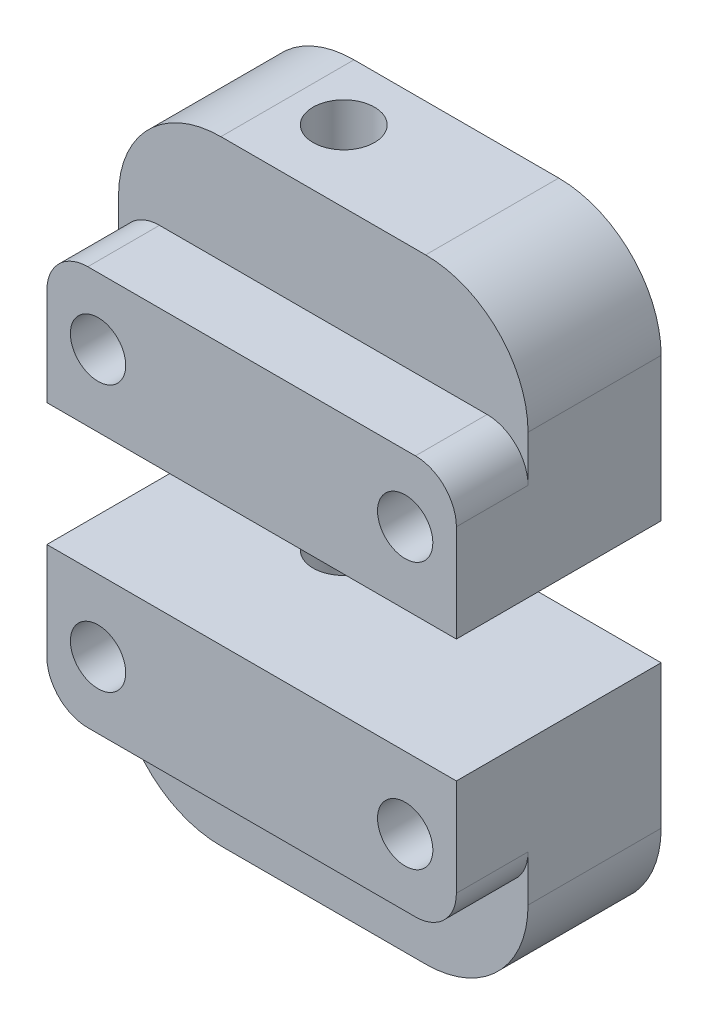
ISO-10303-21;
HEADER;
FILE_DESCRIPTION(('STEP AP214'),'2;1');
FILE_NAME('part.step','',(''),(''),'','','');
FILE_SCHEMA(('AUTOMOTIVE_DESIGN { 1 0 10303 214 1 1 1 1 }'));
ENDSEC;
DATA;
#1=APPLICATION_CONTEXT('core data for automotive mechanical design processes');
#2=APPLICATION_PROTOCOL_DEFINITION('international standard','automotive_design',2000,#1);
#3=PRODUCT_CONTEXT('',#1,'mechanical');
#4=PRODUCT('Part','Part','',(#3));
#5=PRODUCT_RELATED_PRODUCT_CATEGORY('part','',(#4));
#6=PRODUCT_DEFINITION_FORMATION('','',#4);
#7=PRODUCT_DEFINITION_CONTEXT('part definition',#1,'design');
#8=PRODUCT_DEFINITION('design','',#6,#7);
#9=PRODUCT_DEFINITION_SHAPE('','',#8);
#10=(LENGTH_UNIT() NAMED_UNIT(*) SI_UNIT(.MILLI.,.METRE.));
#11=(NAMED_UNIT(*) PLANE_ANGLE_UNIT() SI_UNIT($,.RADIAN.));
#12=(NAMED_UNIT(*) SI_UNIT($,.STERADIAN.) SOLID_ANGLE_UNIT());
#13=UNCERTAINTY_MEASURE_WITH_UNIT(LENGTH_MEASURE(1.E-05),#10,'distance_accuracy_value','');
#14=(GEOMETRIC_REPRESENTATION_CONTEXT(3) GLOBAL_UNCERTAINTY_ASSIGNED_CONTEXT((#13)) GLOBAL_UNIT_ASSIGNED_CONTEXT((#10,
#11,#12)) REPRESENTATION_CONTEXT('',''));
#15=CARTESIAN_POINT('',(0.,0.,0.));
#16=DIRECTION('',(0.,0.,1.));
#17=DIRECTION('',(1.,0.,0.));
#18=AXIS2_PLACEMENT_3D('',#15,#16,#17);
#19=CARTESIAN_POINT('',(-10.,15.,0.));
#20=DIRECTION('',(-1.,0.,0.));
#21=DIRECTION('',(0.,0.,1.));
#22=AXIS2_PLACEMENT_3D('',#19,#20,#21);
#23=PLANE('',#22);
#24=DIRECTION('',(0.,0.,1.));
#25=VECTOR('',#24,1.);
#26=CARTESIAN_POINT('',(-10.,-3.,0.));
#27=LINE('',#26,#25);
#28=CARTESIAN_POINT('',(-10.,-3.,-10.));
#29=VERTEX_POINT('',#28);
#30=CARTESIAN_POINT('',(-10.,-3.,0.));
#31=VERTEX_POINT('',#30);
#32=EDGE_CURVE('E55',#29,#31,#27,.T.);
#33=ORIENTED_EDGE('',*,*,#32,.F.);
#34=DIRECTION('',(0.,-1.,0.));
#35=VECTOR('',#34,1.);
#36=CARTESIAN_POINT('',(-10.,15.,-10.));
#37=LINE('',#36,#35);
#38=CARTESIAN_POINT('',(-10.,-10.,-10.));
#39=VERTEX_POINT('',#38);
#40=EDGE_CURVE('E49',#29,#39,#37,.T.);
#41=ORIENTED_EDGE('',*,*,#40,.T.);
#42=DIRECTION('',(0.,0.,-1.));
#43=VECTOR('',#42,1.);
#44=CARTESIAN_POINT('',(-10.,-10.,-3.5));
#45=LINE('',#44,#43);
#46=CARTESIAN_POINT('',(-10.,-10.,-3.5));
#47=VERTEX_POINT('',#46);
#48=EDGE_CURVE('E162',#39,#47,#45,.F.);
#49=ORIENTED_EDGE('',*,*,#48,.T.);
#50=DIRECTION('',(0.,-1.,0.));
#51=VECTOR('',#50,1.);
#52=CARTESIAN_POINT('',(-10.,0.,-3.5));
#53=LINE('',#52,#51);
#54=CARTESIAN_POINT('',(-10.,-7.75,-3.5));
#55=VERTEX_POINT('',#54);
#56=EDGE_CURVE('E174',#55,#47,#53,.T.);
#57=ORIENTED_EDGE('',*,*,#56,.F.);
#58=DIRECTION('',(0.,0.,-1.));
#59=VECTOR('',#58,1.);
#60=CARTESIAN_POINT('',(-10.,-7.75,0.));
#61=LINE('',#60,#59);
#62=CARTESIAN_POINT('',(-10.,-7.75,0.));
#63=VERTEX_POINT('',#62);
#64=EDGE_CURVE('E158',#55,#63,#61,.F.);
#65=ORIENTED_EDGE('',*,*,#64,.T.);
#66=DIRECTION('',(0.,-1.,0.));
#67=VECTOR('',#66,1.);
#68=CARTESIAN_POINT('',(-10.,15.,0.));
#69=LINE('',#68,#67);
#70=EDGE_CURVE('E155',#31,#63,#69,.T.);
#71=ORIENTED_EDGE('',*,*,#70,.F.);
#72=EDGE_LOOP('',(#33,#41,#49,#57,#65,#71));
#73=FACE_BOUND('',#72,.T.);
#74=ADVANCED_FACE('F46',(#73),#23,.T.);
#75=CARTESIAN_POINT('',(0.,15.,0.));
#76=DIRECTION('',(0.,0.,-1.));
#77=DIRECTION('',(-1.,0.,0.));
#78=AXIS2_PLACEMENT_3D('',#75,#76,#77);
#79=PLANE('',#78);
#80=CARTESIAN_POINT('',(7.5,-6.5,0.));
#81=DIRECTION('',(0.,0.,-1.));
#82=DIRECTION('',(-1.,0.,0.));
#83=AXIS2_PLACEMENT_3D('',#80,#81,#82);
#84=CIRCLE('',#83,1.35);
#85=CARTESIAN_POINT('',(6.15,-6.5,0.));
#86=VERTEX_POINT('',#85);
#87=EDGE_CURVE('E161',#86,#86,#84,.T.);
#88=ORIENTED_EDGE('',*,*,#87,.T.);
#89=EDGE_LOOP('',(#88));
#90=FACE_BOUND('',#89,.T.);
#91=CARTESIAN_POINT('',(-7.5,-6.5,0.));
#92=DIRECTION('',(0.,0.,-1.));
#93=DIRECTION('',(1.,0.,0.));
#94=AXIS2_PLACEMENT_3D('',#91,#92,#93);
#95=CIRCLE('',#94,1.35);
#96=CARTESIAN_POINT('',(-6.15,-6.5,0.));
#97=VERTEX_POINT('',#96);
#98=EDGE_CURVE('E200',#97,#97,#95,.T.);
#99=ORIENTED_EDGE('',*,*,#98,.T.);
#100=EDGE_LOOP('',(#99));
#101=FACE_BOUND('',#100,.T.);
#102=DIRECTION('',(0.,-1.,0.));
#103=VECTOR('',#102,1.);
#104=CARTESIAN_POINT('',(10.,15.,0.));
#105=LINE('',#104,#103);
#106=CARTESIAN_POINT('',(10.,-3.,0.));
#107=VERTEX_POINT('',#106);
#108=CARTESIAN_POINT('',(10.,-7.75,0.));
#109=VERTEX_POINT('',#108);
#110=EDGE_CURVE('E145',#107,#109,#105,.T.);
#111=ORIENTED_EDGE('',*,*,#110,.F.);
#112=DIRECTION('',(-1.,0.,0.));
#113=VECTOR('',#112,1.);
#114=CARTESIAN_POINT('',(10.,-3.,0.));
#115=LINE('',#114,#113);
#116=EDGE_CURVE('E203',#107,#31,#115,.T.);
#117=ORIENTED_EDGE('',*,*,#116,.T.);
#118=ORIENTED_EDGE('',*,*,#70,.T.);
#119=CARTESIAN_POINT('',(-8.,-7.75,0.));
#120=DIRECTION('',(0.,0.,-1.));
#121=DIRECTION('',(-1.,0.,0.));
#122=AXIS2_PLACEMENT_3D('',#119,#120,#121);
#123=CIRCLE('',#122,2.);
#124=CARTESIAN_POINT('',(-8.,-9.75,0.));
#125=VERTEX_POINT('',#124);
#126=EDGE_CURVE('E152',#63,#125,#123,.F.);
#127=ORIENTED_EDGE('',*,*,#126,.T.);
#128=DIRECTION('',(1.,0.,0.));
#129=VECTOR('',#128,1.);
#130=CARTESIAN_POINT('',(-10.,-9.75,0.));
#131=LINE('',#130,#129);
#132=CARTESIAN_POINT('',(8.,-9.75,0.));
#133=VERTEX_POINT('',#132);
#134=EDGE_CURVE('E154',#125,#133,#131,.T.);
#135=ORIENTED_EDGE('',*,*,#134,.T.);
#136=CARTESIAN_POINT('',(8.,-7.75,0.));
#137=DIRECTION('',(0.,0.,-1.));
#138=DIRECTION('',(-1.,0.,0.));
#139=AXIS2_PLACEMENT_3D('',#136,#137,#138);
#140=CIRCLE('',#139,2.);
#141=EDGE_CURVE('E156',#133,#109,#140,.F.);
#142=ORIENTED_EDGE('',*,*,#141,.T.);
#143=EDGE_LOOP('',(#111,#117,#118,#127,#135,#142));
#144=FACE_BOUND('',#143,.T.);
#145=ADVANCED_FACE('F246',(#90,#101,#144),#79,.F.);
#146=CARTESIAN_POINT('',(10.,15.,0.));
#147=DIRECTION('',(-1.,0.,0.));
#148=DIRECTION('',(0.,0.,1.));
#149=AXIS2_PLACEMENT_3D('',#146,#147,#148);
#150=PLANE('',#149);
#151=DIRECTION('',(0.,-1.,0.));
#152=VECTOR('',#151,1.);
#153=CARTESIAN_POINT('',(10.,15.,-10.));
#154=LINE('',#153,#152);
#155=CARTESIAN_POINT('',(10.,-3.,-10.));
#156=VERTEX_POINT('',#155);
#157=CARTESIAN_POINT('',(10.,-10.,-10.));
#158=VERTEX_POINT('',#157);
#159=EDGE_CURVE('E170',#156,#158,#154,.T.);
#160=ORIENTED_EDGE('',*,*,#159,.F.);
#161=DIRECTION('',(0.,0.,1.));
#162=VECTOR('',#161,1.);
#163=CARTESIAN_POINT('',(10.,-3.,0.));
#164=LINE('',#163,#162);
#165=EDGE_CURVE('E148',#156,#107,#164,.T.);
#166=ORIENTED_EDGE('',*,*,#165,.T.);
#167=ORIENTED_EDGE('',*,*,#110,.T.);
#168=DIRECTION('',(0.,0.,-1.));
#169=VECTOR('',#168,1.);
#170=CARTESIAN_POINT('',(10.,-7.75,-3.5));
#171=LINE('',#170,#169);
#172=CARTESIAN_POINT('',(10.,-7.75,-3.5));
#173=VERTEX_POINT('',#172);
#174=EDGE_CURVE('E131',#109,#173,#171,.T.);
#175=ORIENTED_EDGE('',*,*,#174,.T.);
#176=DIRECTION('',(0.,-1.,0.));
#177=VECTOR('',#176,1.);
#178=CARTESIAN_POINT('',(10.,0.,-3.5));
#179=LINE('',#178,#177);
#180=CARTESIAN_POINT('',(10.,-10.,-3.5));
#181=VERTEX_POINT('',#180);
#182=EDGE_CURVE('E116',#173,#181,#179,.T.);
#183=ORIENTED_EDGE('',*,*,#182,.T.);
#184=DIRECTION('',(0.,0.,-1.));
#185=VECTOR('',#184,1.);
#186=CARTESIAN_POINT('',(10.,-10.,0.));
#187=LINE('',#186,#185);
#188=EDGE_CURVE('E130',#181,#158,#187,.T.);
#189=ORIENTED_EDGE('',*,*,#188,.T.);
#190=EDGE_LOOP('',(#160,#166,#167,#175,#183,#189));
#191=FACE_BOUND('',#190,.T.);
#192=ADVANCED_FACE('F142',(#191),#150,.F.);
#193=CARTESIAN_POINT('',(-2.5,15.,-7.));
#194=DIRECTION('',(0.,-1.,0.));
#195=DIRECTION('',(0.,0.,-1.));
#196=AXIS2_PLACEMENT_3D('',#193,#194,#195);
#197=CYLINDRICAL_SURFACE('',#196,1.5);
#198=CARTESIAN_POINT('',(-2.5,-3.,-7.));
#199=DIRECTION('',(0.,-1.,0.));
#200=DIRECTION('',(0.,0.,-1.));
#201=AXIS2_PLACEMENT_3D('',#198,#199,#200);
#202=CIRCLE('',#201,1.5);
#203=CARTESIAN_POINT('',(-2.5,-3.,-8.5));
#204=VERTEX_POINT('',#203);
#205=EDGE_CURVE('E215',#204,#204,#202,.T.);
#206=ORIENTED_EDGE('',*,*,#205,.F.);
#207=EDGE_LOOP('',(#206));
#208=FACE_BOUND('',#207,.T.);
#209=CARTESIAN_POINT('',(-2.5,-15.,-7.));
#210=DIRECTION('',(0.,1.,0.));
#211=DIRECTION('',(0.,0.,1.));
#212=AXIS2_PLACEMENT_3D('',#209,#210,#211);
#213=CIRCLE('',#212,1.5);
#214=CARTESIAN_POINT('',(-2.5,-15.,-5.5));
#215=VERTEX_POINT('',#214);
#216=EDGE_CURVE('E180',#215,#215,#213,.T.);
#217=ORIENTED_EDGE('',*,*,#216,.F.);
#218=EDGE_LOOP('',(#217));
#219=FACE_BOUND('',#218,.T.);
#220=ADVANCED_FACE('F272',(#208,#219),#197,.F.);
#221=CARTESIAN_POINT('',(0.,15.,-10.));
#222=DIRECTION('',(0.,0.,1.));
#223=DIRECTION('',(1.,0.,0.));
#224=AXIS2_PLACEMENT_3D('',#221,#222,#223);
#225=PLANE('',#224);
#226=CARTESIAN_POINT('',(7.5,-6.5,-10.));
#227=DIRECTION('',(0.,0.,-1.));
#228=DIRECTION('',(1.,0.,0.));
#229=AXIS2_PLACEMENT_3D('',#226,#227,#228);
#230=CIRCLE('',#229,2.25);
#231=CARTESIAN_POINT('',(9.75,-6.5,-10.));
#232=VERTEX_POINT('',#231);
#233=EDGE_CURVE('E212',#232,#232,#230,.T.);
#234=ORIENTED_EDGE('',*,*,#233,.F.);
#235=EDGE_LOOP('',(#234));
#236=FACE_BOUND('',#235,.T.);
#237=CARTESIAN_POINT('',(-7.5,-6.5,-10.));
#238=DIRECTION('',(0.,0.,-1.));
#239=DIRECTION('',(-1.,0.,0.));
#240=AXIS2_PLACEMENT_3D('',#237,#238,#239);
#241=CIRCLE('',#240,2.25);
#242=CARTESIAN_POINT('',(-9.75,-6.5,-10.));
#243=VERTEX_POINT('',#242);
#244=EDGE_CURVE('E204',#243,#243,#241,.T.);
#245=ORIENTED_EDGE('',*,*,#244,.F.);
#246=EDGE_LOOP('',(#245));
#247=FACE_BOUND('',#246,.T.);
#248=ORIENTED_EDGE('',*,*,#40,.F.);
#249=DIRECTION('',(-1.,0.,0.));
#250=VECTOR('',#249,1.);
#251=CARTESIAN_POINT('',(10.,-3.,-10.));
#252=LINE('',#251,#250);
#253=EDGE_CURVE('E12',#156,#29,#252,.T.);
#254=ORIENTED_EDGE('',*,*,#253,.F.);
#255=ORIENTED_EDGE('',*,*,#159,.T.);
#256=CARTESIAN_POINT('',(5.,-10.,-10.));
#257=DIRECTION('',(0.,0.,1.));
#258=DIRECTION('',(1.,0.,0.));
#259=AXIS2_PLACEMENT_3D('',#256,#257,#258);
#260=CIRCLE('',#259,5.);
#261=CARTESIAN_POINT('',(5.,-15.,-10.));
#262=VERTEX_POINT('',#261);
#263=EDGE_CURVE('E186',#158,#262,#260,.F.);
#264=ORIENTED_EDGE('',*,*,#263,.T.);
#265=DIRECTION('',(-1.,0.,0.));
#266=VECTOR('',#265,1.);
#267=CARTESIAN_POINT('',(0.,-15.,-10.));
#268=LINE('',#267,#266);
#269=CARTESIAN_POINT('',(-5.,-15.,-10.));
#270=VERTEX_POINT('',#269);
#271=EDGE_CURVE('E185',#262,#270,#268,.T.);
#272=ORIENTED_EDGE('',*,*,#271,.T.);
#273=CARTESIAN_POINT('',(-5.,-10.,-10.));
#274=DIRECTION('',(0.,0.,1.));
#275=DIRECTION('',(1.,0.,0.));
#276=AXIS2_PLACEMENT_3D('',#273,#274,#275);
#277=CIRCLE('',#276,5.);
#278=EDGE_CURVE('E182',#270,#39,#277,.F.);
#279=ORIENTED_EDGE('',*,*,#278,.T.);
#280=EDGE_LOOP('',(#248,#254,#255,#264,#272,#279));
#281=FACE_BOUND('',#280,.T.);
#282=ADVANCED_FACE('F227',(#236,#247,#281),#225,.F.);
#283=CARTESIAN_POINT('',(-7.5,-6.5,0.));
#284=DIRECTION('',(0.,0.,-1.));
#285=DIRECTION('',(-1.,0.,0.));
#286=AXIS2_PLACEMENT_3D('',#283,#284,#285);
#287=CYLINDRICAL_SURFACE('',#286,1.35);
#288=ORIENTED_EDGE('',*,*,#98,.F.);
#289=EDGE_LOOP('',(#288));
#290=FACE_BOUND('',#289,.T.);
#291=CARTESIAN_POINT('',(-7.5,-6.5,-7.));
#292=DIRECTION('',(0.,0.,-1.));
#293=DIRECTION('',(-1.,0.,0.));
#294=AXIS2_PLACEMENT_3D('',#291,#292,#293);
#295=CIRCLE('',#294,1.35);
#296=CARTESIAN_POINT('',(-8.85,-6.5,-7.));
#297=VERTEX_POINT('',#296);
#298=EDGE_CURVE('E208',#297,#297,#295,.F.);
#299=ORIENTED_EDGE('',*,*,#298,.F.);
#300=EDGE_LOOP('',(#299));
#301=FACE_BOUND('',#300,.T.);
#302=ADVANCED_FACE('F278',(#290,#301),#287,.F.);
#303=CARTESIAN_POINT('',(0.,-15.,0.));
#304=DIRECTION('',(0.,1.,0.));
#305=DIRECTION('',(0.,0.,1.));
#306=AXIS2_PLACEMENT_3D('',#303,#304,#305);
#307=PLANE('',#306);
#308=ORIENTED_EDGE('',*,*,#216,.T.);
#309=EDGE_LOOP('',(#308));
#310=FACE_BOUND('',#309,.T.);
#311=DIRECTION('',(1.,0.,0.));
#312=VECTOR('',#311,1.);
#313=CARTESIAN_POINT('',(-10.,-15.,-3.5));
#314=LINE('',#313,#312);
#315=CARTESIAN_POINT('',(-5.,-15.,-3.5));
#316=VERTEX_POINT('',#315);
#317=CARTESIAN_POINT('',(5.,-15.,-3.5));
#318=VERTEX_POINT('',#317);
#319=EDGE_CURVE('E173',#316,#318,#314,.T.);
#320=ORIENTED_EDGE('',*,*,#319,.F.);
#321=DIRECTION('',(0.,0.,-1.));
#322=VECTOR('',#321,1.);
#323=CARTESIAN_POINT('',(-5.,-15.,-10.));
#324=LINE('',#323,#322);
#325=EDGE_CURVE('E176',#316,#270,#324,.T.);
#326=ORIENTED_EDGE('',*,*,#325,.T.);
#327=ORIENTED_EDGE('',*,*,#271,.F.);
#328=DIRECTION('',(0.,0.,-1.));
#329=VECTOR('',#328,1.);
#330=CARTESIAN_POINT('',(5.,-15.,0.));
#331=LINE('',#330,#329);
#332=EDGE_CURVE('E179',#262,#318,#331,.F.);
#333=ORIENTED_EDGE('',*,*,#332,.T.);
#334=EDGE_LOOP('',(#320,#326,#327,#333));
#335=FACE_BOUND('',#334,.T.);
#336=ADVANCED_FACE('F234',(#310,#335),#307,.F.);
#337=CARTESIAN_POINT('',(-10.,0.,-3.5));
#338=DIRECTION('',(0.,0.,1.));
#339=DIRECTION('',(1.,0.,0.));
#340=AXIS2_PLACEMENT_3D('',#337,#338,#339);
#341=PLANE('',#340);
#342=ORIENTED_EDGE('',*,*,#56,.T.);
#343=CARTESIAN_POINT('',(-5.,-10.,-3.5));
#344=DIRECTION('',(0.,0.,1.));
#345=DIRECTION('',(1.,0.,0.));
#346=AXIS2_PLACEMENT_3D('',#343,#344,#345);
#347=CIRCLE('',#346,5.);
#348=EDGE_CURVE('E171',#47,#316,#347,.T.);
#349=ORIENTED_EDGE('',*,*,#348,.T.);
#350=ORIENTED_EDGE('',*,*,#319,.T.);
#351=CARTESIAN_POINT('',(5.,-10.,-3.5));
#352=DIRECTION('',(0.,0.,1.));
#353=DIRECTION('',(1.,0.,0.));
#354=AXIS2_PLACEMENT_3D('',#351,#352,#353);
#355=CIRCLE('',#354,5.);
#356=EDGE_CURVE('E125',#318,#181,#355,.T.);
#357=ORIENTED_EDGE('',*,*,#356,.T.);
#358=ORIENTED_EDGE('',*,*,#182,.F.);
#359=CARTESIAN_POINT('',(8.,-7.75,-3.5));
#360=DIRECTION('',(0.,0.,1.));
#361=DIRECTION('',(1.,0.,0.));
#362=AXIS2_PLACEMENT_3D('',#359,#360,#361);
#363=CIRCLE('',#362,2.);
#364=CARTESIAN_POINT('',(8.,-9.75,-3.5));
#365=VERTEX_POINT('',#364);
#366=EDGE_CURVE('E121',#173,#365,#363,.F.);
#367=ORIENTED_EDGE('',*,*,#366,.T.);
#368=DIRECTION('',(1.,0.,0.));
#369=VECTOR('',#368,1.);
#370=CARTESIAN_POINT('',(-10.,-9.75,-3.5));
#371=LINE('',#370,#369);
#372=CARTESIAN_POINT('',(-8.,-9.75,-3.5));
#373=VERTEX_POINT('',#372);
#374=EDGE_CURVE('E166',#373,#365,#371,.T.);
#375=ORIENTED_EDGE('',*,*,#374,.F.);
#376=CARTESIAN_POINT('',(-8.,-7.75,-3.5));
#377=DIRECTION('',(0.,0.,1.));
#378=DIRECTION('',(1.,0.,0.));
#379=AXIS2_PLACEMENT_3D('',#376,#377,#378);
#380=CIRCLE('',#379,2.);
#381=EDGE_CURVE('E139',#373,#55,#380,.F.);
#382=ORIENTED_EDGE('',*,*,#381,.T.);
#383=EDGE_LOOP('',(#342,#349,#350,#357,#358,#367,#375,#382));
#384=FACE_BOUND('',#383,.T.);
#385=ADVANCED_FACE('F119',(#384),#341,.T.);
#386=CARTESIAN_POINT('',(-10.,-9.75,0.));
#387=DIRECTION('',(0.,-1.,0.));
#388=DIRECTION('',(0.,0.,-1.));
#389=AXIS2_PLACEMENT_3D('',#386,#387,#388);
#390=PLANE('',#389);
#391=ORIENTED_EDGE('',*,*,#134,.F.);
#392=DIRECTION('',(0.,0.,-1.));
#393=VECTOR('',#392,1.);
#394=CARTESIAN_POINT('',(-8.,-9.75,0.));
#395=LINE('',#394,#393);
#396=EDGE_CURVE('E163',#125,#373,#395,.T.);
#397=ORIENTED_EDGE('',*,*,#396,.T.);
#398=ORIENTED_EDGE('',*,*,#374,.T.);
#399=DIRECTION('',(0.,0.,-1.));
#400=VECTOR('',#399,1.);
#401=CARTESIAN_POINT('',(8.,-9.75,0.));
#402=LINE('',#401,#400);
#403=EDGE_CURVE('E138',#365,#133,#402,.F.);
#404=ORIENTED_EDGE('',*,*,#403,.T.);
#405=EDGE_LOOP('',(#391,#397,#398,#404));
#406=FACE_BOUND('',#405,.T.);
#407=ADVANCED_FACE('F251',(#406),#390,.T.);
#408=CARTESIAN_POINT('',(7.5,-6.5,0.));
#409=DIRECTION('',(0.,0.,-1.));
#410=DIRECTION('',(-1.,0.,0.));
#411=AXIS2_PLACEMENT_3D('',#408,#409,#410);
#412=CYLINDRICAL_SURFACE('',#411,1.35);
#413=CARTESIAN_POINT('',(7.5,-6.5,-7.));
#414=DIRECTION('',(0.,0.,1.));
#415=DIRECTION('',(1.,0.,0.));
#416=AXIS2_PLACEMENT_3D('',#413,#414,#415);
#417=CIRCLE('',#416,1.35);
#418=CARTESIAN_POINT('',(8.85,-6.5,-7.));
#419=VERTEX_POINT('',#418);
#420=EDGE_CURVE('E168',#419,#419,#417,.F.);
#421=ORIENTED_EDGE('',*,*,#420,.T.);
#422=EDGE_LOOP('',(#421));
#423=FACE_BOUND('',#422,.T.);
#424=ORIENTED_EDGE('',*,*,#87,.F.);
#425=EDGE_LOOP('',(#424));
#426=FACE_BOUND('',#425,.T.);
#427=ADVANCED_FACE('F304',(#423,#426),#412,.F.);
#428=CARTESIAN_POINT('',(-5.,-10.,0.));
#429=DIRECTION('',(0.,0.,1.));
#430=DIRECTION('',(1.,0.,0.));
#431=AXIS2_PLACEMENT_3D('',#428,#429,#430);
#432=CYLINDRICAL_SURFACE('',#431,5.);
#433=ORIENTED_EDGE('',*,*,#348,.F.);
#434=ORIENTED_EDGE('',*,*,#48,.F.);
#435=ORIENTED_EDGE('',*,*,#278,.F.);
#436=ORIENTED_EDGE('',*,*,#325,.F.);
#437=EDGE_LOOP('',(#433,#434,#435,#436));
#438=FACE_BOUND('',#437,.T.);
#439=ADVANCED_FACE('F240',(#438),#432,.T.);
#440=CARTESIAN_POINT('',(5.,-10.,0.));
#441=DIRECTION('',(0.,0.,-1.));
#442=DIRECTION('',(-1.,0.,0.));
#443=AXIS2_PLACEMENT_3D('',#440,#441,#442);
#444=CYLINDRICAL_SURFACE('',#443,5.);
#445=ORIENTED_EDGE('',*,*,#356,.F.);
#446=ORIENTED_EDGE('',*,*,#332,.F.);
#447=ORIENTED_EDGE('',*,*,#263,.F.);
#448=ORIENTED_EDGE('',*,*,#188,.F.);
#449=EDGE_LOOP('',(#445,#446,#447,#448));
#450=FACE_BOUND('',#449,.T.);
#451=ADVANCED_FACE('F231',(#450),#444,.T.);
#452=CARTESIAN_POINT('',(-8.,-7.75,0.));
#453=DIRECTION('',(0.,0.,-1.));
#454=DIRECTION('',(-1.,0.,0.));
#455=AXIS2_PLACEMENT_3D('',#452,#453,#454);
#456=CYLINDRICAL_SURFACE('',#455,2.);
#457=ORIENTED_EDGE('',*,*,#126,.F.);
#458=ORIENTED_EDGE('',*,*,#64,.F.);
#459=ORIENTED_EDGE('',*,*,#381,.F.);
#460=ORIENTED_EDGE('',*,*,#396,.F.);
#461=EDGE_LOOP('',(#457,#458,#459,#460));
#462=FACE_BOUND('',#461,.T.);
#463=ADVANCED_FACE('F253',(#462),#456,.T.);
#464=CARTESIAN_POINT('',(8.,-7.75,0.));
#465=DIRECTION('',(0.,0.,1.));
#466=DIRECTION('',(1.,0.,0.));
#467=AXIS2_PLACEMENT_3D('',#464,#465,#466);
#468=CYLINDRICAL_SURFACE('',#467,2.);
#469=ORIENTED_EDGE('',*,*,#141,.F.);
#470=ORIENTED_EDGE('',*,*,#403,.F.);
#471=ORIENTED_EDGE('',*,*,#366,.F.);
#472=ORIENTED_EDGE('',*,*,#174,.F.);
#473=EDGE_LOOP('',(#469,#470,#471,#472));
#474=FACE_BOUND('',#473,.T.);
#475=ADVANCED_FACE('F137',(#474),#468,.T.);
#476=CARTESIAN_POINT('',(-7.5,-6.5,-7.));
#477=DIRECTION('',(0.,0.,-1.));
#478=DIRECTION('',(-1.,0.,0.));
#479=AXIS2_PLACEMENT_3D('',#476,#477,#478);
#480=PLANE('',#479);
#481=CARTESIAN_POINT('',(-7.5,-6.5,-7.));
#482=DIRECTION('',(0.,0.,-1.));
#483=DIRECTION('',(-1.,0.,0.));
#484=AXIS2_PLACEMENT_3D('',#481,#482,#483);
#485=CIRCLE('',#484,2.25);
#486=CARTESIAN_POINT('',(-9.75,-6.5,-7.));
#487=VERTEX_POINT('',#486);
#488=EDGE_CURVE('E209',#487,#487,#485,.T.);
#489=ORIENTED_EDGE('',*,*,#488,.T.);
#490=EDGE_LOOP('',(#489));
#491=FACE_BOUND('',#490,.T.);
#492=ORIENTED_EDGE('',*,*,#298,.T.);
#493=EDGE_LOOP('',(#492));
#494=FACE_BOUND('',#493,.T.);
#495=ADVANCED_FACE('F261',(#491,#494),#480,.T.);
#496=CARTESIAN_POINT('',(-7.5,-6.5,-7.));
#497=DIRECTION('',(0.,0.,-1.));
#498=DIRECTION('',(-1.,0.,0.));
#499=AXIS2_PLACEMENT_3D('',#496,#497,#498);
#500=CYLINDRICAL_SURFACE('',#499,2.25);
#501=ORIENTED_EDGE('',*,*,#488,.F.);
#502=EDGE_LOOP('',(#501));
#503=FACE_BOUND('',#502,.T.);
#504=ORIENTED_EDGE('',*,*,#244,.T.);
#505=EDGE_LOOP('',(#504));
#506=FACE_BOUND('',#505,.T.);
#507=ADVANCED_FACE('F290',(#503,#506),#500,.F.);
#508=CARTESIAN_POINT('',(7.5,-6.5,-7.));
#509=DIRECTION('',(0.,0.,1.));
#510=DIRECTION('',(1.,0.,0.));
#511=AXIS2_PLACEMENT_3D('',#508,#509,#510);
#512=PLANE('',#511);
#513=CARTESIAN_POINT('',(7.5,-6.5,-7.));
#514=DIRECTION('',(0.,0.,-1.));
#515=DIRECTION('',(1.,0.,0.));
#516=AXIS2_PLACEMENT_3D('',#513,#514,#515);
#517=CIRCLE('',#516,2.25);
#518=CARTESIAN_POINT('',(9.75,-6.5,-7.));
#519=VERTEX_POINT('',#518);
#520=EDGE_CURVE('E207',#519,#519,#517,.T.);
#521=ORIENTED_EDGE('',*,*,#520,.T.);
#522=EDGE_LOOP('',(#521));
#523=FACE_BOUND('',#522,.T.);
#524=ORIENTED_EDGE('',*,*,#420,.F.);
#525=EDGE_LOOP('',(#524));
#526=FACE_BOUND('',#525,.T.);
#527=ADVANCED_FACE('F287',(#523,#526),#512,.F.);
#528=CARTESIAN_POINT('',(7.5,-6.5,-7.));
#529=DIRECTION('',(0.,0.,-1.));
#530=DIRECTION('',(-1.,0.,0.));
#531=AXIS2_PLACEMENT_3D('',#528,#529,#530);
#532=CYLINDRICAL_SURFACE('',#531,2.25);
#533=ORIENTED_EDGE('',*,*,#520,.F.);
#534=EDGE_LOOP('',(#533));
#535=FACE_BOUND('',#534,.T.);
#536=ORIENTED_EDGE('',*,*,#233,.T.);
#537=EDGE_LOOP('',(#536));
#538=FACE_BOUND('',#537,.T.);
#539=ADVANCED_FACE('F285',(#535,#538),#532,.F.);
#540=CARTESIAN_POINT('',(10.,-3.,0.));
#541=DIRECTION('',(0.,-1.,0.));
#542=DIRECTION('',(0.,0.,-1.));
#543=AXIS2_PLACEMENT_3D('',#540,#541,#542);
#544=PLANE('',#543);
#545=ORIENTED_EDGE('',*,*,#205,.T.);
#546=EDGE_LOOP('',(#545));
#547=FACE_BOUND('',#546,.T.);
#548=ORIENTED_EDGE('',*,*,#32,.T.);
#549=ORIENTED_EDGE('',*,*,#116,.F.);
#550=ORIENTED_EDGE('',*,*,#165,.F.);
#551=ORIENTED_EDGE('',*,*,#253,.T.);
#552=EDGE_LOOP('',(#548,#549,#550,#551));
#553=FACE_BOUND('',#552,.T.);
#554=ADVANCED_FACE('F244',(#547,#553),#544,.F.);
#555=CLOSED_SHELL('',(#74,#145,#192,#220,#282,#302,#336,#385,#407,#427,#439,#451,#463,#475,#495,
#507,#527,#539,#554));
#556=MANIFOLD_SOLID_BREP('B2',#555);
#557=CARTESIAN_POINT('',(7.5,6.5,-7.));
#558=DIRECTION('',(0.,0.,-1.));
#559=DIRECTION('',(-1.,0.,0.));
#560=AXIS2_PLACEMENT_3D('',#557,#558,#559);
#561=PLANE('',#560);
#562=CARTESIAN_POINT('',(7.5,6.5,-7.));
#563=DIRECTION('',(0.,0.,-1.));
#564=DIRECTION('',(-1.,0.,0.));
#565=AXIS2_PLACEMENT_3D('',#562,#563,#564);
#566=CIRCLE('',#565,2.25);
#567=CARTESIAN_POINT('',(5.25,6.5,-7.));
#568=VERTEX_POINT('',#567);
#569=EDGE_CURVE('E588',#568,#568,#566,.T.);
#570=ORIENTED_EDGE('',*,*,#569,.T.);
#571=EDGE_LOOP('',(#570));
#572=FACE_BOUND('',#571,.T.);
#573=CARTESIAN_POINT('',(7.5,6.5,-7.));
#574=DIRECTION('',(0.,0.,-1.));
#575=DIRECTION('',(-1.,0.,0.));
#576=AXIS2_PLACEMENT_3D('',#573,#574,#575);
#577=CIRCLE('',#576,1.35);
#578=CARTESIAN_POINT('',(6.15,6.5,-7.));
#579=VERTEX_POINT('',#578);
#580=EDGE_CURVE('E586',#579,#579,#577,.F.);
#581=ORIENTED_EDGE('',*,*,#580,.T.);
#582=EDGE_LOOP('',(#581));
#583=FACE_BOUND('',#582,.T.);
#584=ADVANCED_FACE('F451',(#572,#583),#561,.T.);
#585=CARTESIAN_POINT('',(-7.5,6.5,-7.));
#586=DIRECTION('',(0.,0.,1.));
#587=DIRECTION('',(1.,0.,0.));
#588=AXIS2_PLACEMENT_3D('',#585,#586,#587);
#589=PLANE('',#588);
#590=CARTESIAN_POINT('',(-7.5,6.5,-7.));
#591=DIRECTION('',(0.,0.,-1.));
#592=DIRECTION('',(1.,0.,0.));
#593=AXIS2_PLACEMENT_3D('',#590,#591,#592);
#594=CIRCLE('',#593,2.25);
#595=CARTESIAN_POINT('',(-5.25,6.5,-7.));
#596=VERTEX_POINT('',#595);
#597=EDGE_CURVE('E599',#596,#596,#594,.T.);
#598=ORIENTED_EDGE('',*,*,#597,.T.);
#599=EDGE_LOOP('',(#598));
#600=FACE_BOUND('',#599,.T.);
#601=CARTESIAN_POINT('',(-7.5,6.5,-7.));
#602=DIRECTION('',(0.,0.,1.));
#603=DIRECTION('',(1.,0.,0.));
#604=AXIS2_PLACEMENT_3D('',#601,#602,#603);
#605=CIRCLE('',#604,1.35);
#606=CARTESIAN_POINT('',(-6.15,6.5,-7.));
#607=VERTEX_POINT('',#606);
#608=EDGE_CURVE('E455',#607,#607,#605,.F.);
#609=ORIENTED_EDGE('',*,*,#608,.F.);
#610=EDGE_LOOP('',(#609));
#611=FACE_BOUND('',#610,.T.);
#612=ADVANCED_FACE('F671',(#600,#611),#589,.F.);
#613=CARTESIAN_POINT('',(-8.,7.75,0.));
#614=DIRECTION('',(0.,0.,1.));
#615=DIRECTION('',(1.,0.,0.));
#616=AXIS2_PLACEMENT_3D('',#613,#614,#615);
#617=CYLINDRICAL_SURFACE('',#616,2.);
#618=CARTESIAN_POINT('',(-8.,7.75,0.));
#619=DIRECTION('',(0.,0.,-1.));
#620=DIRECTION('',(-1.,0.,0.));
#621=AXIS2_PLACEMENT_3D('',#618,#619,#620);
#622=CIRCLE('',#621,2.);
#623=CARTESIAN_POINT('',(-8.,9.75,0.));
#624=VERTEX_POINT('',#623);
#625=CARTESIAN_POINT('',(-10.,7.75,0.));
#626=VERTEX_POINT('',#625);
#627=EDGE_CURVE('E578',#624,#626,#622,.F.);
#628=ORIENTED_EDGE('',*,*,#627,.F.);
#629=DIRECTION('',(0.,0.,-1.));
#630=VECTOR('',#629,1.);
#631=CARTESIAN_POINT('',(-8.,9.75,0.));
#632=LINE('',#631,#630);
#633=CARTESIAN_POINT('',(-8.,9.75,-3.5));
#634=VERTEX_POINT('',#633);
#635=EDGE_CURVE('E583',#634,#624,#632,.F.);
#636=ORIENTED_EDGE('',*,*,#635,.F.);
#637=CARTESIAN_POINT('',(-8.,7.75,-3.5));
#638=DIRECTION('',(0.,0.,1.));
#639=DIRECTION('',(1.,0.,0.));
#640=AXIS2_PLACEMENT_3D('',#637,#638,#639);
#641=CIRCLE('',#640,2.);
#642=CARTESIAN_POINT('',(-10.,7.75,-3.5));
#643=VERTEX_POINT('',#642);
#644=EDGE_CURVE('E460',#643,#634,#641,.F.);
#645=ORIENTED_EDGE('',*,*,#644,.F.);
#646=DIRECTION('',(0.,0.,-1.));
#647=VECTOR('',#646,1.);
#648=CARTESIAN_POINT('',(-10.,7.75,-3.5));
#649=LINE('',#648,#647);
#650=EDGE_CURVE('E573',#626,#643,#649,.T.);
#651=ORIENTED_EDGE('',*,*,#650,.F.);
#652=EDGE_LOOP('',(#628,#636,#645,#651));
#653=FACE_BOUND('',#652,.T.);
#654=ADVANCED_FACE('F675',(#653),#617,.T.);
#655=CARTESIAN_POINT('',(-10.,9.75,0.));
#656=DIRECTION('',(0.,-1.,0.));
#657=DIRECTION('',(0.,0.,-1.));
#658=AXIS2_PLACEMENT_3D('',#655,#656,#657);
#659=PLANE('',#658);
#660=DIRECTION('',(1.,0.,0.));
#661=VECTOR('',#660,1.);
#662=CARTESIAN_POINT('',(-10.,9.75,-3.5));
#663=LINE('',#662,#661);
#664=CARTESIAN_POINT('',(8.,9.75,-3.5));
#665=VERTEX_POINT('',#664);
#666=EDGE_CURVE('E614',#634,#665,#663,.T.);
#667=ORIENTED_EDGE('',*,*,#666,.F.);
#668=ORIENTED_EDGE('',*,*,#635,.T.);
#669=DIRECTION('',(1.,0.,0.));
#670=VECTOR('',#669,1.);
#671=CARTESIAN_POINT('',(-10.,9.75,0.));
#672=LINE('',#671,#670);
#673=CARTESIAN_POINT('',(8.,9.75,0.));
#674=VERTEX_POINT('',#673);
#675=EDGE_CURVE('E618',#624,#674,#672,.T.);
#676=ORIENTED_EDGE('',*,*,#675,.T.);
#677=DIRECTION('',(0.,0.,-1.));
#678=VECTOR('',#677,1.);
#679=CARTESIAN_POINT('',(8.,9.75,0.));
#680=LINE('',#679,#678);
#681=EDGE_CURVE('E580',#674,#665,#680,.T.);
#682=ORIENTED_EDGE('',*,*,#681,.T.);
#683=EDGE_LOOP('',(#667,#668,#676,#682));
#684=FACE_BOUND('',#683,.T.);
#685=ADVANCED_FACE('F709',(#684),#659,.F.);
#686=CARTESIAN_POINT('',(-7.5,6.5,0.));
#687=DIRECTION('',(0.,0.,-1.));
#688=DIRECTION('',(-1.,0.,0.));
#689=AXIS2_PLACEMENT_3D('',#686,#687,#688);
#690=CYLINDRICAL_SURFACE('',#689,1.35);
#691=ORIENTED_EDGE('',*,*,#608,.T.);
#692=EDGE_LOOP('',(#691));
#693=FACE_BOUND('',#692,.T.);
#694=CARTESIAN_POINT('',(-7.5,6.5,0.));
#695=DIRECTION('',(0.,0.,-1.));
#696=DIRECTION('',(-1.,0.,0.));
#697=AXIS2_PLACEMENT_3D('',#694,#695,#696);
#698=CIRCLE('',#697,1.35);
#699=CARTESIAN_POINT('',(-8.84999999999999,6.5,0.));
#700=VERTEX_POINT('',#699);
#701=EDGE_CURVE('E605',#700,#700,#698,.T.);
#702=ORIENTED_EDGE('',*,*,#701,.F.);
#703=EDGE_LOOP('',(#702));
#704=FACE_BOUND('',#703,.T.);
#705=ADVANCED_FACE('F726',(#693,#704),#690,.F.);
#706=CARTESIAN_POINT('',(7.5,6.5,0.));
#707=DIRECTION('',(0.,0.,-1.));
#708=DIRECTION('',(-1.,0.,0.));
#709=AXIS2_PLACEMENT_3D('',#706,#707,#708);
#710=CYLINDRICAL_SURFACE('',#709,1.35);
#711=CARTESIAN_POINT('',(7.5,6.5,0.));
#712=DIRECTION('',(0.,0.,-1.));
#713=DIRECTION('',(1.,0.,0.));
#714=AXIS2_PLACEMENT_3D('',#711,#712,#713);
#715=CIRCLE('',#714,1.35);
#716=CARTESIAN_POINT('',(8.85,6.5,0.));
#717=VERTEX_POINT('',#716);
#718=EDGE_CURVE('E592',#717,#717,#715,.T.);
#719=ORIENTED_EDGE('',*,*,#718,.F.);
#720=EDGE_LOOP('',(#719));
#721=FACE_BOUND('',#720,.T.);
#722=ORIENTED_EDGE('',*,*,#580,.F.);
#723=EDGE_LOOP('',(#722));
#724=FACE_BOUND('',#723,.T.);
#725=ADVANCED_FACE('F731',(#721,#724),#710,.F.);
#726=CARTESIAN_POINT('',(8.,7.75,0.));
#727=DIRECTION('',(0.,0.,-1.));
#728=DIRECTION('',(-1.,0.,0.));
#729=AXIS2_PLACEMENT_3D('',#726,#727,#728);
#730=CYLINDRICAL_SURFACE('',#729,2.);
#731=CARTESIAN_POINT('',(8.,7.75,0.));
#732=DIRECTION('',(0.,0.,-1.));
#733=DIRECTION('',(-1.,0.,0.));
#734=AXIS2_PLACEMENT_3D('',#731,#732,#733);
#735=CIRCLE('',#734,2.);
#736=CARTESIAN_POINT('',(10.,7.75,0.));
#737=VERTEX_POINT('',#736);
#738=EDGE_CURVE('E576',#737,#674,#735,.F.);
#739=ORIENTED_EDGE('',*,*,#738,.F.);
#740=DIRECTION('',(0.,0.,-1.));
#741=VECTOR('',#740,1.);
#742=CARTESIAN_POINT('',(10.,7.75,0.));
#743=LINE('',#742,#741);
#744=CARTESIAN_POINT('',(10.,7.75,-3.5));
#745=VERTEX_POINT('',#744);
#746=EDGE_CURVE('E547',#745,#737,#743,.F.);
#747=ORIENTED_EDGE('',*,*,#746,.F.);
#748=CARTESIAN_POINT('',(8.,7.75,-3.5));
#749=DIRECTION('',(0.,0.,1.));
#750=DIRECTION('',(1.,0.,0.));
#751=AXIS2_PLACEMENT_3D('',#748,#749,#750);
#752=CIRCLE('',#751,2.);
#753=EDGE_CURVE('E44',#665,#745,#752,.F.);
#754=ORIENTED_EDGE('',*,*,#753,.F.);
#755=ORIENTED_EDGE('',*,*,#681,.F.);
#756=EDGE_LOOP('',(#739,#747,#754,#755));
#757=FACE_BOUND('',#756,.T.);
#758=ADVANCED_FACE('F453',(#757),#730,.T.);
#759=CARTESIAN_POINT('',(-10.,0.,-3.5));
#760=DIRECTION('',(0.,0.,1.));
#761=DIRECTION('',(1.,0.,0.));
#762=AXIS2_PLACEMENT_3D('',#759,#760,#761);
#763=PLANE('',#762);
#764=DIRECTION('',(1.,0.,0.));
#765=VECTOR('',#764,1.);
#766=CARTESIAN_POINT('',(-10.,15.,-3.5));
#767=LINE('',#766,#765);
#768=CARTESIAN_POINT('',(-5.,15.,-3.5));
#769=VERTEX_POINT('',#768);
#770=CARTESIAN_POINT('',(5.,15.,-3.5));
#771=VERTEX_POINT('',#770);
#772=EDGE_CURVE('E613',#769,#771,#767,.T.);
#773=ORIENTED_EDGE('',*,*,#772,.F.);
#774=CARTESIAN_POINT('',(-5.,10.,-3.5));
#775=DIRECTION('',(0.,0.,1.));
#776=DIRECTION('',(1.,0.,0.));
#777=AXIS2_PLACEMENT_3D('',#774,#775,#776);
#778=CIRCLE('',#777,5.);
#779=CARTESIAN_POINT('',(-10.,10.,-3.5));
#780=VERTEX_POINT('',#779);
#781=EDGE_CURVE('E569',#769,#780,#778,.T.);
#782=ORIENTED_EDGE('',*,*,#781,.T.);
#783=DIRECTION('',(0.,-1.,0.));
#784=VECTOR('',#783,1.);
#785=CARTESIAN_POINT('',(-10.,0.,-3.5));
#786=LINE('',#785,#784);
#787=EDGE_CURVE('E611',#780,#643,#786,.T.);
#788=ORIENTED_EDGE('',*,*,#787,.T.);
#789=ORIENTED_EDGE('',*,*,#644,.T.);
#790=ORIENTED_EDGE('',*,*,#666,.T.);
#791=ORIENTED_EDGE('',*,*,#753,.T.);
#792=DIRECTION('',(0.,-1.,0.));
#793=VECTOR('',#792,1.);
#794=CARTESIAN_POINT('',(10.,0.,-3.5));
#795=LINE('',#794,#793);
#796=CARTESIAN_POINT('',(10.,10.,-3.5));
#797=VERTEX_POINT('',#796);
#798=EDGE_CURVE('E476',#797,#745,#795,.T.);
#799=ORIENTED_EDGE('',*,*,#798,.F.);
#800=CARTESIAN_POINT('',(5.,10.,-3.5));
#801=DIRECTION('',(0.,0.,1.));
#802=DIRECTION('',(1.,0.,0.));
#803=AXIS2_PLACEMENT_3D('',#800,#801,#802);
#804=CIRCLE('',#803,5.);
#805=EDGE_CURVE('E567',#797,#771,#804,.T.);
#806=ORIENTED_EDGE('',*,*,#805,.T.);
#807=EDGE_LOOP('',(#773,#782,#788,#789,#790,#791,#799,#806));
#808=FACE_BOUND('',#807,.T.);
#809=ADVANCED_FACE('F701',(#808),#763,.T.);
#810=CARTESIAN_POINT('',(5.,10.,0.));
#811=DIRECTION('',(0.,0.,1.));
#812=DIRECTION('',(1.,0.,0.));
#813=AXIS2_PLACEMENT_3D('',#810,#811,#812);
#814=CYLINDRICAL_SURFACE('',#813,5.);
#815=ORIENTED_EDGE('',*,*,#805,.F.);
#816=DIRECTION('',(0.,0.,-1.));
#817=VECTOR('',#816,1.);
#818=CARTESIAN_POINT('',(10.,10.,-3.5));
#819=LINE('',#818,#817);
#820=CARTESIAN_POINT('',(10.,10.,-10.));
#821=VERTEX_POINT('',#820);
#822=EDGE_CURVE('E571',#821,#797,#819,.F.);
#823=ORIENTED_EDGE('',*,*,#822,.F.);
#824=CARTESIAN_POINT('',(5.,10.,-10.));
#825=DIRECTION('',(0.,0.,1.));
#826=DIRECTION('',(1.,0.,0.));
#827=AXIS2_PLACEMENT_3D('',#824,#825,#826);
#828=CIRCLE('',#827,5.);
#829=CARTESIAN_POINT('',(5.,15.,-10.));
#830=VERTEX_POINT('',#829);
#831=EDGE_CURVE('E558',#830,#821,#828,.F.);
#832=ORIENTED_EDGE('',*,*,#831,.F.);
#833=DIRECTION('',(0.,0.,-1.));
#834=VECTOR('',#833,1.);
#835=CARTESIAN_POINT('',(5.,15.,-10.));
#836=LINE('',#835,#834);
#837=EDGE_CURVE('E562',#771,#830,#836,.T.);
#838=ORIENTED_EDGE('',*,*,#837,.F.);
#839=EDGE_LOOP('',(#815,#823,#832,#838));
#840=FACE_BOUND('',#839,.T.);
#841=ADVANCED_FACE('F689',(#840),#814,.T.);
#842=CARTESIAN_POINT('',(-2.5,15.,-7.));
#843=DIRECTION('',(0.,-1.,0.));
#844=DIRECTION('',(0.,0.,-1.));
#845=AXIS2_PLACEMENT_3D('',#842,#843,#844);
#846=CYLINDRICAL_SURFACE('',#845,1.5);
#847=CARTESIAN_POINT('',(-2.5,3.,-7.));
#848=DIRECTION('',(0.,1.,0.));
#849=DIRECTION('',(0.,0.,1.));
#850=AXIS2_PLACEMENT_3D('',#847,#848,#849);
#851=CIRCLE('',#850,1.5);
#852=CARTESIAN_POINT('',(-2.5,3.,-5.5));
#853=VERTEX_POINT('',#852);
#854=EDGE_CURVE('E636',#853,#853,#851,.T.);
#855=ORIENTED_EDGE('',*,*,#854,.F.);
#856=EDGE_LOOP('',(#855));
#857=FACE_BOUND('',#856,.T.);
#858=CARTESIAN_POINT('',(-2.5,15.,-7.));
#859=DIRECTION('',(0.,1.,0.));
#860=DIRECTION('',(0.,0.,1.));
#861=AXIS2_PLACEMENT_3D('',#858,#859,#860);
#862=CIRCLE('',#861,1.5);
#863=CARTESIAN_POINT('',(-2.5,15.,-5.5));
#864=VERTEX_POINT('',#863);
#865=EDGE_CURVE('E617',#864,#864,#862,.T.);
#866=ORIENTED_EDGE('',*,*,#865,.T.);
#867=EDGE_LOOP('',(#866));
#868=FACE_BOUND('',#867,.T.);
#869=ADVANCED_FACE('F686',(#857,#868),#846,.F.);
#870=CARTESIAN_POINT('',(0.,15.,0.));
#871=DIRECTION('',(0.,1.,0.));
#872=DIRECTION('',(0.,0.,1.));
#873=AXIS2_PLACEMENT_3D('',#870,#871,#872);
#874=PLANE('',#873);
#875=ORIENTED_EDGE('',*,*,#865,.F.);
#876=EDGE_LOOP('',(#875));
#877=FACE_BOUND('',#876,.T.);
#878=DIRECTION('',(-1.,0.,0.));
#879=VECTOR('',#878,1.);
#880=CARTESIAN_POINT('',(0.,15.,-10.));
#881=LINE('',#880,#879);
#882=CARTESIAN_POINT('',(-5.,15.,-10.));
#883=VERTEX_POINT('',#882);
#884=EDGE_CURVE('E625',#830,#883,#881,.T.);
#885=ORIENTED_EDGE('',*,*,#884,.T.);
#886=DIRECTION('',(0.,0.,-1.));
#887=VECTOR('',#886,1.);
#888=CARTESIAN_POINT('',(-5.,15.,0.));
#889=LINE('',#888,#887);
#890=EDGE_CURVE('E565',#883,#769,#889,.F.);
#891=ORIENTED_EDGE('',*,*,#890,.T.);
#892=ORIENTED_EDGE('',*,*,#772,.T.);
#893=ORIENTED_EDGE('',*,*,#837,.T.);
#894=EDGE_LOOP('',(#885,#891,#892,#893));
#895=FACE_BOUND('',#894,.T.);
#896=ADVANCED_FACE('F665',(#877,#895),#874,.T.);
#897=CARTESIAN_POINT('',(-5.,10.,0.));
#898=DIRECTION('',(0.,0.,-1.));
#899=DIRECTION('',(-1.,0.,0.));
#900=AXIS2_PLACEMENT_3D('',#897,#898,#899);
#901=CYLINDRICAL_SURFACE('',#900,5.);
#902=ORIENTED_EDGE('',*,*,#781,.F.);
#903=ORIENTED_EDGE('',*,*,#890,.F.);
#904=CARTESIAN_POINT('',(-5.,10.,-10.));
#905=DIRECTION('',(0.,0.,1.));
#906=DIRECTION('',(1.,0.,0.));
#907=AXIS2_PLACEMENT_3D('',#904,#905,#906);
#908=CIRCLE('',#907,5.);
#909=CARTESIAN_POINT('',(-10.,10.,-10.));
#910=VERTEX_POINT('',#909);
#911=EDGE_CURVE('E560',#910,#883,#908,.F.);
#912=ORIENTED_EDGE('',*,*,#911,.F.);
#913=DIRECTION('',(0.,0.,-1.));
#914=VECTOR('',#913,1.);
#915=CARTESIAN_POINT('',(-10.,10.,0.));
#916=LINE('',#915,#914);
#917=EDGE_CURVE('E550',#780,#910,#916,.T.);
#918=ORIENTED_EDGE('',*,*,#917,.F.);
#919=EDGE_LOOP('',(#902,#903,#912,#918));
#920=FACE_BOUND('',#919,.T.);
#921=ADVANCED_FACE('F656',(#920),#901,.T.);
#922=CARTESIAN_POINT('',(7.5,6.5,-7.));
#923=DIRECTION('',(0.,0.,-1.));
#924=DIRECTION('',(-1.,0.,0.));
#925=AXIS2_PLACEMENT_3D('',#922,#923,#924);
#926=CYLINDRICAL_SURFACE('',#925,2.25);
#927=ORIENTED_EDGE('',*,*,#569,.F.);
#928=EDGE_LOOP('',(#927));
#929=FACE_BOUND('',#928,.T.);
#930=CARTESIAN_POINT('',(7.5,6.5,-10.));
#931=DIRECTION('',(0.,0.,-1.));
#932=DIRECTION('',(-1.,0.,0.));
#933=AXIS2_PLACEMENT_3D('',#930,#931,#932);
#934=CIRCLE('',#933,2.25);
#935=CARTESIAN_POINT('',(5.25,6.5,-10.));
#936=VERTEX_POINT('',#935);
#937=EDGE_CURVE('E594',#936,#936,#934,.T.);
#938=ORIENTED_EDGE('',*,*,#937,.T.);
#939=EDGE_LOOP('',(#938));
#940=FACE_BOUND('',#939,.T.);
#941=ADVANCED_FACE('F654',(#929,#940),#926,.F.);
#942=CARTESIAN_POINT('',(-7.5,6.5,-7.));
#943=DIRECTION('',(0.,0.,-1.));
#944=DIRECTION('',(-1.,0.,0.));
#945=AXIS2_PLACEMENT_3D('',#942,#943,#944);
#946=CYLINDRICAL_SURFACE('',#945,2.25);
#947=ORIENTED_EDGE('',*,*,#597,.F.);
#948=EDGE_LOOP('',(#947));
#949=FACE_BOUND('',#948,.T.);
#950=CARTESIAN_POINT('',(-7.5,6.5,-10.));
#951=DIRECTION('',(0.,0.,-1.));
#952=DIRECTION('',(1.,0.,0.));
#953=AXIS2_PLACEMENT_3D('',#950,#951,#952);
#954=CIRCLE('',#953,2.25);
#955=CARTESIAN_POINT('',(-5.25,6.5,-10.));
#956=VERTEX_POINT('',#955);
#957=EDGE_CURVE('E602',#956,#956,#954,.T.);
#958=ORIENTED_EDGE('',*,*,#957,.T.);
#959=EDGE_LOOP('',(#958));
#960=FACE_BOUND('',#959,.T.);
#961=ADVANCED_FACE('F647',(#949,#960),#946,.F.);
#962=CARTESIAN_POINT('',(0.,15.,-10.));
#963=DIRECTION('',(0.,0.,1.));
#964=DIRECTION('',(1.,0.,0.));
#965=AXIS2_PLACEMENT_3D('',#962,#963,#964);
#966=PLANE('',#965);
#967=ORIENTED_EDGE('',*,*,#957,.F.);
#968=EDGE_LOOP('',(#967));
#969=FACE_BOUND('',#968,.T.);
#970=ORIENTED_EDGE('',*,*,#937,.F.);
#971=EDGE_LOOP('',(#970));
#972=FACE_BOUND('',#971,.T.);
#973=DIRECTION('',(0.,-1.,0.));
#974=VECTOR('',#973,1.);
#975=CARTESIAN_POINT('',(10.,15.,-10.));
#976=LINE('',#975,#974);
#977=CARTESIAN_POINT('',(10.,3.,-10.));
#978=VERTEX_POINT('',#977);
#979=EDGE_CURVE('E548',#821,#978,#976,.T.);
#980=ORIENTED_EDGE('',*,*,#979,.T.);
#981=DIRECTION('',(-1.,0.,0.));
#982=VECTOR('',#981,1.);
#983=CARTESIAN_POINT('',(10.,3.,-10.));
#984=LINE('',#983,#982);
#985=CARTESIAN_POINT('',(-10.,3.,-10.));
#986=VERTEX_POINT('',#985);
#987=EDGE_CURVE('E531',#978,#986,#984,.T.);
#988=ORIENTED_EDGE('',*,*,#987,.T.);
#989=DIRECTION('',(0.,-1.,0.));
#990=VECTOR('',#989,1.);
#991=CARTESIAN_POINT('',(-10.,15.,-10.));
#992=LINE('',#991,#990);
#993=EDGE_CURVE('E552',#910,#986,#992,.T.);
#994=ORIENTED_EDGE('',*,*,#993,.F.);
#995=ORIENTED_EDGE('',*,*,#911,.T.);
#996=ORIENTED_EDGE('',*,*,#884,.F.);
#997=ORIENTED_EDGE('',*,*,#831,.T.);
#998=EDGE_LOOP('',(#980,#988,#994,#995,#996,#997));
#999=FACE_BOUND('',#998,.T.);
#1000=ADVANCED_FACE('F634',(#969,#972,#999),#966,.F.);
#1001=CARTESIAN_POINT('',(10.,15.,0.));
#1002=DIRECTION('',(-1.,0.,0.));
#1003=DIRECTION('',(0.,0.,1.));
#1004=AXIS2_PLACEMENT_3D('',#1001,#1002,#1003);
#1005=PLANE('',#1004);
#1006=DIRECTION('',(0.,-1.,0.));
#1007=VECTOR('',#1006,1.);
#1008=CARTESIAN_POINT('',(10.,15.,0.));
#1009=LINE('',#1008,#1007);
#1010=CARTESIAN_POINT('',(10.,3.,0.));
#1011=VERTEX_POINT('',#1010);
#1012=EDGE_CURVE('E540',#737,#1011,#1009,.T.);
#1013=ORIENTED_EDGE('',*,*,#1012,.T.);
#1014=DIRECTION('',(0.,0.,-1.));
#1015=VECTOR('',#1014,1.);
#1016=CARTESIAN_POINT('',(10.,3.,0.));
#1017=LINE('',#1016,#1015);
#1018=EDGE_CURVE('E527',#1011,#978,#1017,.T.);
#1019=ORIENTED_EDGE('',*,*,#1018,.T.);
#1020=ORIENTED_EDGE('',*,*,#979,.F.);
#1021=ORIENTED_EDGE('',*,*,#822,.T.);
#1022=ORIENTED_EDGE('',*,*,#798,.T.);
#1023=ORIENTED_EDGE('',*,*,#746,.T.);
#1024=EDGE_LOOP('',(#1013,#1019,#1020,#1021,#1022,#1023));
#1025=FACE_BOUND('',#1024,.T.);
#1026=ADVANCED_FACE('F545',(#1025),#1005,.F.);
#1027=CARTESIAN_POINT('',(0.,15.,0.));
#1028=DIRECTION('',(0.,0.,-1.));
#1029=DIRECTION('',(-1.,0.,0.));
#1030=AXIS2_PLACEMENT_3D('',#1027,#1028,#1029);
#1031=PLANE('',#1030);
#1032=ORIENTED_EDGE('',*,*,#718,.T.);
#1033=EDGE_LOOP('',(#1032));
#1034=FACE_BOUND('',#1033,.T.);
#1035=ORIENTED_EDGE('',*,*,#701,.T.);
#1036=EDGE_LOOP('',(#1035));
#1037=FACE_BOUND('',#1036,.T.);
#1038=DIRECTION('',(0.,-1.,0.));
#1039=VECTOR('',#1038,1.);
#1040=CARTESIAN_POINT('',(-10.,15.,0.));
#1041=LINE('',#1040,#1039);
#1042=CARTESIAN_POINT('',(-10.,3.,0.));
#1043=VERTEX_POINT('',#1042);
#1044=EDGE_CURVE('E543',#626,#1043,#1041,.T.);
#1045=ORIENTED_EDGE('',*,*,#1044,.T.);
#1046=DIRECTION('',(-1.,0.,0.));
#1047=VECTOR('',#1046,1.);
#1048=CARTESIAN_POINT('',(10.,3.,0.));
#1049=LINE('',#1048,#1047);
#1050=EDGE_CURVE('E530',#1011,#1043,#1049,.T.);
#1051=ORIENTED_EDGE('',*,*,#1050,.F.);
#1052=ORIENTED_EDGE('',*,*,#1012,.F.);
#1053=ORIENTED_EDGE('',*,*,#738,.T.);
#1054=ORIENTED_EDGE('',*,*,#675,.F.);
#1055=ORIENTED_EDGE('',*,*,#627,.T.);
#1056=EDGE_LOOP('',(#1045,#1051,#1052,#1053,#1054,#1055));
#1057=FACE_BOUND('',#1056,.T.);
#1058=ADVANCED_FACE('F539',(#1034,#1037,#1057),#1031,.F.);
#1059=CARTESIAN_POINT('',(-10.,15.,0.));
#1060=DIRECTION('',(-1.,0.,0.));
#1061=DIRECTION('',(0.,0.,1.));
#1062=AXIS2_PLACEMENT_3D('',#1059,#1060,#1061);
#1063=PLANE('',#1062);
#1064=DIRECTION('',(0.,0.,-1.));
#1065=VECTOR('',#1064,1.);
#1066=CARTESIAN_POINT('',(-10.,3.,0.));
#1067=LINE('',#1066,#1065);
#1068=EDGE_CURVE('E468',#1043,#986,#1067,.T.);
#1069=ORIENTED_EDGE('',*,*,#1068,.F.);
#1070=ORIENTED_EDGE('',*,*,#1044,.F.);
#1071=ORIENTED_EDGE('',*,*,#650,.T.);
#1072=ORIENTED_EDGE('',*,*,#787,.F.);
#1073=ORIENTED_EDGE('',*,*,#917,.T.);
#1074=ORIENTED_EDGE('',*,*,#993,.T.);
#1075=EDGE_LOOP('',(#1069,#1070,#1071,#1072,#1073,#1074));
#1076=FACE_BOUND('',#1075,.T.);
#1077=ADVANCED_FACE('F630',(#1076),#1063,.T.);
#1078=CARTESIAN_POINT('',(10.,3.,0.));
#1079=DIRECTION('',(0.,1.,0.));
#1080=DIRECTION('',(0.,0.,1.));
#1081=AXIS2_PLACEMENT_3D('',#1078,#1079,#1080);
#1082=PLANE('',#1081);
#1083=ORIENTED_EDGE('',*,*,#854,.T.);
#1084=EDGE_LOOP('',(#1083));
#1085=FACE_BOUND('',#1084,.T.);
#1086=ORIENTED_EDGE('',*,*,#1068,.T.);
#1087=ORIENTED_EDGE('',*,*,#987,.F.);
#1088=ORIENTED_EDGE('',*,*,#1018,.F.);
#1089=ORIENTED_EDGE('',*,*,#1050,.T.);
#1090=EDGE_LOOP('',(#1086,#1087,#1088,#1089));
#1091=FACE_BOUND('',#1090,.T.);
#1092=ADVANCED_FACE('F529',(#1085,#1091),#1082,.F.);
#1093=CLOSED_SHELL('',(#584,#612,#654,#685,#705,#725,#758,#809,#841,#869,#896,#921,#941,#961,
#1000,#1026,#1058,#1077,#1092));
#1094=MANIFOLD_SOLID_BREP('B6',#1093);
#1095=ADVANCED_BREP_SHAPE_REPRESENTATION('',(#18,#556,#1094),#14);
#1096=SHAPE_DEFINITION_REPRESENTATION(#9,#1095);
ENDSEC;
END-ISO-10303-21;
